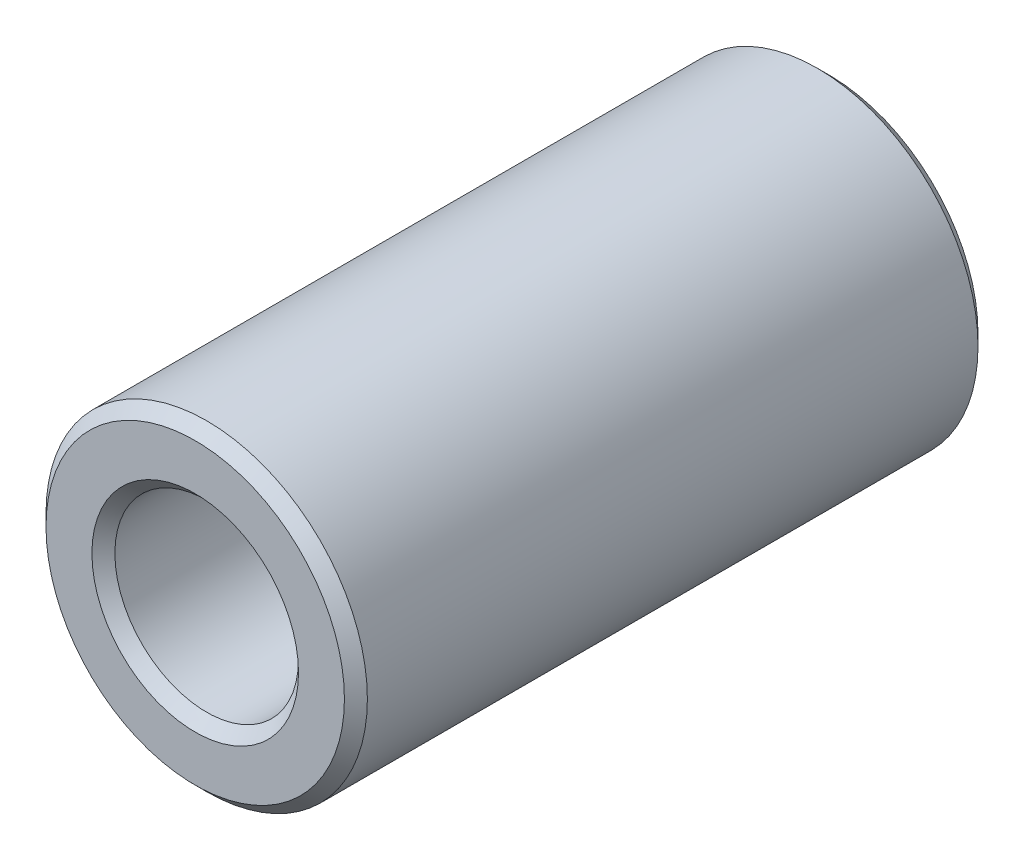
ISO-10303-21;
HEADER;
FILE_DESCRIPTION(('STEP AP214'),'2;1');
FILE_NAME('part.step','',(''),(''),'','','');
FILE_SCHEMA(('AUTOMOTIVE_DESIGN { 1 0 10303 214 1 1 1 1 }'));
ENDSEC;
DATA;
#1=APPLICATION_CONTEXT('core data for automotive mechanical design processes');
#2=APPLICATION_PROTOCOL_DEFINITION('international standard','automotive_design',2000,#1);
#3=PRODUCT_CONTEXT('',#1,'mechanical');
#4=PRODUCT('Part','Part','',(#3));
#5=PRODUCT_RELATED_PRODUCT_CATEGORY('part','',(#4));
#6=PRODUCT_DEFINITION_FORMATION('','',#4);
#7=PRODUCT_DEFINITION_CONTEXT('part definition',#1,'design');
#8=PRODUCT_DEFINITION('design','',#6,#7);
#9=PRODUCT_DEFINITION_SHAPE('','',#8);
#10=(LENGTH_UNIT() NAMED_UNIT(*) SI_UNIT(.MILLI.,.METRE.));
#11=(NAMED_UNIT(*) PLANE_ANGLE_UNIT() SI_UNIT($,.RADIAN.));
#12=(NAMED_UNIT(*) SI_UNIT($,.STERADIAN.) SOLID_ANGLE_UNIT());
#13=UNCERTAINTY_MEASURE_WITH_UNIT(LENGTH_MEASURE(1.E-05),#10,'distance_accuracy_value','');
#14=(GEOMETRIC_REPRESENTATION_CONTEXT(3) GLOBAL_UNCERTAINTY_ASSIGNED_CONTEXT((#13)) GLOBAL_UNIT_ASSIGNED_CONTEXT((#10,
#11,#12)) REPRESENTATION_CONTEXT('',''));
#15=CARTESIAN_POINT('',(0.,0.,0.));
#16=DIRECTION('',(0.,0.,1.));
#17=DIRECTION('',(1.,0.,0.));
#18=AXIS2_PLACEMENT_3D('',#15,#16,#17);
#19=CARTESIAN_POINT('',(0.,0.,27.6));
#20=DIRECTION('',(0.,0.,1.));
#21=DIRECTION('',(1.,0.,0.));
#22=AXIS2_PLACEMENT_3D('',#19,#20,#21);
#23=PLANE('',#22);
#24=CARTESIAN_POINT('',(0.,0.,27.6));
#25=DIRECTION('',(0.,0.,1.));
#26=DIRECTION('',(1.,0.,0.));
#27=AXIS2_PLACEMENT_3D('',#24,#25,#26);
#28=CIRCLE('',#27,4.5);
#29=CARTESIAN_POINT('',(4.5,0.,27.6));
#30=VERTEX_POINT('',#29);
#31=EDGE_CURVE('E10',#30,#30,#28,.F.);
#32=ORIENTED_EDGE('',*,*,#31,.T.);
#33=EDGE_LOOP('',(#32));
#34=FACE_BOUND('',#33,.T.);
#35=CARTESIAN_POINT('',(0.,0.,27.6));
#36=DIRECTION('',(0.,0.,1.));
#37=DIRECTION('',(1.,0.,0.));
#38=AXIS2_PLACEMENT_3D('',#35,#36,#37);
#39=CIRCLE('',#38,6.49999999999999);
#40=CARTESIAN_POINT('',(6.49999999999999,0.,27.6));
#41=VERTEX_POINT('',#40);
#42=EDGE_CURVE('E35',#41,#41,#39,.T.);
#43=ORIENTED_EDGE('',*,*,#42,.T.);
#44=EDGE_LOOP('',(#43));
#45=FACE_BOUND('',#44,.T.);
#46=ADVANCED_FACE('F28',(#34,#45),#23,.T.);
#47=CARTESIAN_POINT('',(0.,0.,0.));
#48=DIRECTION('',(0.,0.,1.));
#49=DIRECTION('',(1.,0.,0.));
#50=AXIS2_PLACEMENT_3D('',#47,#48,#49);
#51=PLANE('',#50);
#52=CARTESIAN_POINT('',(0.,0.,0.));
#53=DIRECTION('',(0.,0.,1.));
#54=DIRECTION('',(1.,0.,0.));
#55=AXIS2_PLACEMENT_3D('',#52,#53,#54);
#56=CIRCLE('',#55,4.50000000000001);
#57=CARTESIAN_POINT('',(4.50000000000001,0.,0.));
#58=VERTEX_POINT('',#57);
#59=EDGE_CURVE('E54',#58,#58,#56,.T.);
#60=ORIENTED_EDGE('',*,*,#59,.T.);
#61=EDGE_LOOP('',(#60));
#62=FACE_BOUND('',#61,.T.);
#63=CARTESIAN_POINT('',(0.,0.,0.));
#64=DIRECTION('',(0.,0.,1.));
#65=DIRECTION('',(1.,0.,0.));
#66=AXIS2_PLACEMENT_3D('',#63,#64,#65);
#67=CIRCLE('',#66,6.5);
#68=CARTESIAN_POINT('',(6.5,0.,0.));
#69=VERTEX_POINT('',#68);
#70=EDGE_CURVE('E57',#69,#69,#67,.F.);
#71=ORIENTED_EDGE('',*,*,#70,.T.);
#72=EDGE_LOOP('',(#71));
#73=FACE_BOUND('',#72,.T.);
#74=ADVANCED_FACE('F61',(#62,#73),#51,.F.);
#75=CARTESIAN_POINT('',(0.,0.,27.6));
#76=DIRECTION('',(0.,0.,-1.));
#77=DIRECTION('',(-1.,0.,0.));
#78=AXIS2_PLACEMENT_3D('',#75,#76,#77);
#79=CYLINDRICAL_SURFACE('',#78,7.);
#80=CARTESIAN_POINT('',(0.,0.,0.500000000000007));
#81=DIRECTION('',(0.,0.,1.));
#82=DIRECTION('',(1.,0.,0.));
#83=AXIS2_PLACEMENT_3D('',#80,#81,#82);
#84=CIRCLE('',#83,7.);
#85=CARTESIAN_POINT('',(-7.,0.,0.500000000000007));
#86=VERTEX_POINT('',#85);
#87=EDGE_CURVE('E39',#86,#86,#84,.T.);
#88=CARTESIAN_POINT('',(0.,0.,27.1));
#89=DIRECTION('',(0.,0.,1.));
#90=DIRECTION('',(1.,0.,0.));
#91=AXIS2_PLACEMENT_3D('',#88,#89,#90);
#92=CIRCLE('',#91,7.);
#93=CARTESIAN_POINT('',(-7.,0.,27.1));
#94=VERTEX_POINT('',#93);
#95=EDGE_CURVE('E43',#94,#94,#92,.F.);
#96=CARTESIAN_POINT('',(-7.,0.,0.500000000000007));
#97=CARTESIAN_POINT('',(-7.,0.,0.77708333333334));
#98=CARTESIAN_POINT('',(-7.,0.,1.05416666666667));
#99=CARTESIAN_POINT('',(-7.,0.,1.60833333333334));
#100=CARTESIAN_POINT('',(-7.,0.,1.88541666666667));
#101=CARTESIAN_POINT('',(-7.,0.,2.43958333333334));
#102=CARTESIAN_POINT('',(-7.,0.,2.71666666666667));
#103=CARTESIAN_POINT('',(-7.,0.,3.27083333333334));
#104=CARTESIAN_POINT('',(-7.,0.,3.54791666666667));
#105=CARTESIAN_POINT('',(-7.,0.,4.10208333333334));
#106=CARTESIAN_POINT('',(-7.,0.,4.37916666666667));
#107=CARTESIAN_POINT('',(-7.,0.,4.93333333333334));
#108=CARTESIAN_POINT('',(-7.,0.,5.21041666666667));
#109=CARTESIAN_POINT('',(-7.,0.,5.76458333333334));
#110=CARTESIAN_POINT('',(-7.,0.,6.04166666666667));
#111=CARTESIAN_POINT('',(-7.,0.,6.59583333333334));
#112=CARTESIAN_POINT('',(-7.,0.,6.87291666666667));
#113=CARTESIAN_POINT('',(-7.,0.,7.42708333333334));
#114=CARTESIAN_POINT('',(-7.,0.,7.70416666666667));
#115=CARTESIAN_POINT('',(-7.,0.,8.25833333333334));
#116=CARTESIAN_POINT('',(-7.,0.,8.53541666666667));
#117=CARTESIAN_POINT('',(-7.,0.,9.08958333333334));
#118=CARTESIAN_POINT('',(-7.,0.,9.36666666666667));
#119=CARTESIAN_POINT('',(-7.,0.,9.92083333333334));
#120=CARTESIAN_POINT('',(-7.,0.,10.1979166666667));
#121=CARTESIAN_POINT('',(-7.,0.,10.7520833333333));
#122=CARTESIAN_POINT('',(-7.,0.,11.0291666666667));
#123=CARTESIAN_POINT('',(-7.,0.,11.5833333333333));
#124=CARTESIAN_POINT('',(-7.,0.,11.8604166666667));
#125=CARTESIAN_POINT('',(-7.,0.,12.4145833333333));
#126=CARTESIAN_POINT('',(-7.,0.,12.6916666666667));
#127=CARTESIAN_POINT('',(-7.,0.,13.2458333333333));
#128=CARTESIAN_POINT('',(-7.,0.,13.5229166666667));
#129=CARTESIAN_POINT('',(-7.,0.,14.0770833333333));
#130=CARTESIAN_POINT('',(-7.,0.,14.3541666666667));
#131=CARTESIAN_POINT('',(-7.,0.,14.9083333333333));
#132=CARTESIAN_POINT('',(-7.,0.,15.1854166666667));
#133=CARTESIAN_POINT('',(-7.,0.,15.7395833333333));
#134=CARTESIAN_POINT('',(-7.,0.,16.0166666666667));
#135=CARTESIAN_POINT('',(-7.,0.,16.5708333333333));
#136=CARTESIAN_POINT('',(-7.,0.,16.8479166666667));
#137=CARTESIAN_POINT('',(-7.,0.,17.4020833333333));
#138=CARTESIAN_POINT('',(-7.,0.,17.6791666666667));
#139=CARTESIAN_POINT('',(-7.,0.,18.2333333333333));
#140=CARTESIAN_POINT('',(-7.,0.,18.5104166666667));
#141=CARTESIAN_POINT('',(-7.,0.,19.0645833333333));
#142=CARTESIAN_POINT('',(-7.,0.,19.3416666666667));
#143=CARTESIAN_POINT('',(-7.,0.,19.8958333333333));
#144=CARTESIAN_POINT('',(-7.,0.,20.1729166666667));
#145=CARTESIAN_POINT('',(-7.,0.,20.7270833333333));
#146=CARTESIAN_POINT('',(-7.,0.,21.0041666666667));
#147=CARTESIAN_POINT('',(-7.,0.,21.5583333333333));
#148=CARTESIAN_POINT('',(-7.,0.,21.8354166666667));
#149=CARTESIAN_POINT('',(-7.,0.,22.3895833333333));
#150=CARTESIAN_POINT('',(-7.,0.,22.6666666666667));
#151=CARTESIAN_POINT('',(-7.,0.,23.2208333333333));
#152=CARTESIAN_POINT('',(-7.,0.,23.4979166666667));
#153=CARTESIAN_POINT('',(-7.,0.,24.0520833333333));
#154=CARTESIAN_POINT('',(-7.,0.,24.3291666666667));
#155=CARTESIAN_POINT('',(-7.,0.,24.8833333333333));
#156=CARTESIAN_POINT('',(-7.,0.,25.1604166666667));
#157=CARTESIAN_POINT('',(-7.,0.,25.7145833333333));
#158=CARTESIAN_POINT('',(-7.,0.,25.9916666666667));
#159=CARTESIAN_POINT('',(-7.,0.,26.5458333333333));
#160=CARTESIAN_POINT('',(-7.,0.,26.8229166666667));
#161=CARTESIAN_POINT('',(-7.,0.,27.1));
#162=B_SPLINE_CURVE_WITH_KNOTS('',3,(#96,#97,#98,#99,#100,#101,#102,#103,#104,#105,#106,#107,
#108,#109,#110,#111,#112,#113,#114,#115,#116,#117,#118,#119,#120,#121,#122,#123,#124,#125,#126,
#127,#128,#129,#130,#131,#132,#133,#134,#135,#136,#137,#138,#139,#140,#141,#142,#143,#144,#145,
#146,#147,#148,#149,#150,#151,#152,#153,#154,#155,#156,#157,#158,#159,#160,#161),.UNSPECIFIED.,
.F.,.F.,(4,2,2,2,2,2,2,2,2,2,2,2,2,2,2,2,2,2,2,2,2,2,2,2,2,2,2,2,2,2,2,2,4),(0.,
0.831249999999999,1.6625,2.49375,3.325,4.15625,4.9875,5.81875,6.65,7.48125,8.3125,9.14375,9.975,
10.80625,11.6375,12.46875,13.3,14.13125,14.9625,15.79375,16.625,17.45625,18.2875,19.11875,19.95,
20.78125,21.6125,22.44375,23.275,24.10625,24.9375,25.76875,26.6),.UNSPECIFIED.);
#163=EDGE_CURVE('BSEAM30',#86,#94,#162,.T.);
#164=ORIENTED_EDGE('',*,*,#87,.T.);
#165=ORIENTED_EDGE('',*,*,#95,.T.);
#166=ORIENTED_EDGE('',*,*,#163,.T.);
#167=ORIENTED_EDGE('',*,*,#163,.F.);
#168=EDGE_LOOP('',(#164,#166,#165,#167));
#169=FACE_BOUND('',#168,.T.);
#170=ADVANCED_FACE('F30',(#169),#79,.T.);
#171=CARTESIAN_POINT('',(0.,0.,27.6));
#172=DIRECTION('',(0.,0.,-1.));
#173=DIRECTION('',(-1.,0.,0.));
#174=AXIS2_PLACEMENT_3D('',#171,#172,#173);
#175=CYLINDRICAL_SURFACE('',#174,4.);
#176=CARTESIAN_POINT('',(0.,0.,0.500000000000004));
#177=DIRECTION('',(0.,0.,1.));
#178=DIRECTION('',(1.,0.,0.));
#179=AXIS2_PLACEMENT_3D('',#176,#177,#178);
#180=CIRCLE('',#179,4.);
#181=CARTESIAN_POINT('',(-4.,0.,0.5));
#182=VERTEX_POINT('',#181);
#183=EDGE_CURVE('E48',#182,#182,#180,.F.);
#184=CARTESIAN_POINT('',(0.,0.,27.1));
#185=DIRECTION('',(0.,0.,1.));
#186=DIRECTION('',(1.,0.,0.));
#187=AXIS2_PLACEMENT_3D('',#184,#185,#186);
#188=CIRCLE('',#187,4.);
#189=CARTESIAN_POINT('',(-4.,0.,27.1));
#190=VERTEX_POINT('',#189);
#191=EDGE_CURVE('E51',#190,#190,#188,.T.);
#192=CARTESIAN_POINT('',(-4.,0.,0.5));
#193=CARTESIAN_POINT('',(-4.,0.,0.777083333333333));
#194=CARTESIAN_POINT('',(-4.,0.,1.05416666666667));
#195=CARTESIAN_POINT('',(-4.,0.,1.60833333333333));
#196=CARTESIAN_POINT('',(-4.,0.,1.88541666666667));
#197=CARTESIAN_POINT('',(-4.,0.,2.43958333333333));
#198=CARTESIAN_POINT('',(-4.,0.,2.71666666666667));
#199=CARTESIAN_POINT('',(-4.,0.,3.27083333333333));
#200=CARTESIAN_POINT('',(-4.,0.,3.54791666666667));
#201=CARTESIAN_POINT('',(-4.,0.,4.10208333333334));
#202=CARTESIAN_POINT('',(-4.,0.,4.37916666666667));
#203=CARTESIAN_POINT('',(-4.,0.,4.93333333333333));
#204=CARTESIAN_POINT('',(-4.,0.,5.21041666666667));
#205=CARTESIAN_POINT('',(-4.,0.,5.76458333333333));
#206=CARTESIAN_POINT('',(-4.,0.,6.04166666666667));
#207=CARTESIAN_POINT('',(-4.,0.,6.59583333333333));
#208=CARTESIAN_POINT('',(-4.,0.,6.87291666666667));
#209=CARTESIAN_POINT('',(-4.,0.,7.42708333333333));
#210=CARTESIAN_POINT('',(-4.,0.,7.70416666666667));
#211=CARTESIAN_POINT('',(-4.,0.,8.25833333333333));
#212=CARTESIAN_POINT('',(-4.,0.,8.53541666666667));
#213=CARTESIAN_POINT('',(-4.,0.,9.08958333333333));
#214=CARTESIAN_POINT('',(-4.,0.,9.36666666666667));
#215=CARTESIAN_POINT('',(-4.,0.,9.92083333333333));
#216=CARTESIAN_POINT('',(-4.,0.,10.1979166666667));
#217=CARTESIAN_POINT('',(-4.,0.,10.7520833333333));
#218=CARTESIAN_POINT('',(-4.,0.,11.0291666666667));
#219=CARTESIAN_POINT('',(-4.,0.,11.5833333333333));
#220=CARTESIAN_POINT('',(-4.,0.,11.8604166666667));
#221=CARTESIAN_POINT('',(-4.,0.,12.4145833333333));
#222=CARTESIAN_POINT('',(-4.,0.,12.6916666666667));
#223=CARTESIAN_POINT('',(-4.,0.,13.2458333333333));
#224=CARTESIAN_POINT('',(-4.,0.,13.5229166666667));
#225=CARTESIAN_POINT('',(-4.,0.,14.0770833333333));
#226=CARTESIAN_POINT('',(-4.,0.,14.3541666666667));
#227=CARTESIAN_POINT('',(-4.,0.,14.9083333333333));
#228=CARTESIAN_POINT('',(-4.,0.,15.1854166666667));
#229=CARTESIAN_POINT('',(-4.,0.,15.7395833333333));
#230=CARTESIAN_POINT('',(-4.,0.,16.0166666666667));
#231=CARTESIAN_POINT('',(-4.,0.,16.5708333333333));
#232=CARTESIAN_POINT('',(-4.,0.,16.8479166666667));
#233=CARTESIAN_POINT('',(-4.,0.,17.4020833333333));
#234=CARTESIAN_POINT('',(-4.,0.,17.6791666666667));
#235=CARTESIAN_POINT('',(-4.,0.,18.2333333333333));
#236=CARTESIAN_POINT('',(-4.,0.,18.5104166666667));
#237=CARTESIAN_POINT('',(-4.,0.,19.0645833333333));
#238=CARTESIAN_POINT('',(-4.,0.,19.3416666666667));
#239=CARTESIAN_POINT('',(-4.,0.,19.8958333333333));
#240=CARTESIAN_POINT('',(-4.,0.,20.1729166666667));
#241=CARTESIAN_POINT('',(-4.,0.,20.7270833333333));
#242=CARTESIAN_POINT('',(-4.,0.,21.0041666666667));
#243=CARTESIAN_POINT('',(-4.,0.,21.5583333333333));
#244=CARTESIAN_POINT('',(-4.,0.,21.8354166666667));
#245=CARTESIAN_POINT('',(-4.,0.,22.3895833333333));
#246=CARTESIAN_POINT('',(-4.,0.,22.6666666666667));
#247=CARTESIAN_POINT('',(-4.,0.,23.2208333333333));
#248=CARTESIAN_POINT('',(-4.,0.,23.4979166666667));
#249=CARTESIAN_POINT('',(-4.,0.,24.0520833333333));
#250=CARTESIAN_POINT('',(-4.,0.,24.3291666666667));
#251=CARTESIAN_POINT('',(-4.,0.,24.8833333333333));
#252=CARTESIAN_POINT('',(-4.,0.,25.1604166666667));
#253=CARTESIAN_POINT('',(-4.,0.,25.7145833333333));
#254=CARTESIAN_POINT('',(-4.,0.,25.9916666666667));
#255=CARTESIAN_POINT('',(-4.,0.,26.5458333333333));
#256=CARTESIAN_POINT('',(-4.,0.,26.8229166666667));
#257=CARTESIAN_POINT('',(-4.,0.,27.1));
#258=B_SPLINE_CURVE_WITH_KNOTS('',3,(#192,#193,#194,#195,#196,#197,#198,#199,#200,#201,#202,
#203,#204,#205,#206,#207,#208,#209,#210,#211,#212,#213,#214,#215,#216,#217,#218,#219,#220,#221,
#222,#223,#224,#225,#226,#227,#228,#229,#230,#231,#232,#233,#234,#235,#236,#237,#238,#239,#240,
#241,#242,#243,#244,#245,#246,#247,#248,#249,#250,#251,#252,#253,#254,#255,#256,#257),
.UNSPECIFIED.,.F.,.F.,(4,2,2,2,2,2,2,2,2,2,2,2,2,2,2,2,2,2,2,2,2,2,2,2,2,2,2,2,2,2,2,2,4),(0.,
0.831249999999999,1.6625,2.49375,3.325,4.15625,4.9875,5.81875,6.65,7.48125,8.3125,9.14375,9.975,
10.80625,11.6375,12.46875,13.3,14.13125,14.9625,15.79375,16.625,17.45625,18.2875,19.11875,19.95,
20.78125,21.6125,22.44375,23.275,24.10625,24.9375,25.76875,26.6),.UNSPECIFIED.);
#259=EDGE_CURVE('BSEAM73',#182,#190,#258,.T.);
#260=ORIENTED_EDGE('',*,*,#183,.T.);
#261=ORIENTED_EDGE('',*,*,#191,.T.);
#262=ORIENTED_EDGE('',*,*,#259,.T.);
#263=ORIENTED_EDGE('',*,*,#259,.F.);
#264=EDGE_LOOP('',(#260,#262,#261,#263));
#265=FACE_BOUND('',#264,.T.);
#266=ADVANCED_FACE('F73',(#265),#175,.F.);
#267=CARTESIAN_POINT('',(0.,0.,0.));
#268=DIRECTION('',(0.,0.,-1.));
#269=DIRECTION('',(-1.,0.,0.));
#270=AXIS2_PLACEMENT_3D('',#267,#268,#269);
#271=CONICAL_SURFACE('',#270,4.50000000000001,0.785398163397453);
#272=ORIENTED_EDGE('',*,*,#183,.F.);
#273=EDGE_LOOP('',(#272));
#274=FACE_BOUND('',#273,.T.);
#275=ORIENTED_EDGE('',*,*,#59,.F.);
#276=EDGE_LOOP('',(#275));
#277=FACE_BOUND('',#276,.T.);
#278=ADVANCED_FACE('F67',(#274,#277),#271,.F.);
#279=CARTESIAN_POINT('',(0.,0.,0.500000000000007));
#280=DIRECTION('',(0.,0.,1.));
#281=DIRECTION('',(1.,0.,0.));
#282=AXIS2_PLACEMENT_3D('',#279,#280,#281);
#283=CONICAL_SURFACE('',#282,7.,0.785398163397445);
#284=ORIENTED_EDGE('',*,*,#70,.F.);
#285=EDGE_LOOP('',(#284));
#286=FACE_BOUND('',#285,.T.);
#287=ORIENTED_EDGE('',*,*,#87,.F.);
#288=EDGE_LOOP('',(#287));
#289=FACE_BOUND('',#288,.T.);
#290=ADVANCED_FACE('F63',(#286,#289),#283,.T.);
#291=CARTESIAN_POINT('',(0.,0.,27.1));
#292=DIRECTION('',(0.,0.,1.));
#293=DIRECTION('',(1.,0.,0.));
#294=AXIS2_PLACEMENT_3D('',#291,#292,#293);
#295=CONICAL_SURFACE('',#294,4.,0.785398163397445);
#296=ORIENTED_EDGE('',*,*,#31,.F.);
#297=EDGE_LOOP('',(#296));
#298=FACE_BOUND('',#297,.T.);
#299=ORIENTED_EDGE('',*,*,#191,.F.);
#300=EDGE_LOOP('',(#299));
#301=FACE_BOUND('',#300,.T.);
#302=ADVANCED_FACE('F66',(#298,#301),#295,.F.);
#303=CARTESIAN_POINT('',(0.,0.,27.6));
#304=DIRECTION('',(0.,0.,-1.));
#305=DIRECTION('',(-1.,0.,0.));
#306=AXIS2_PLACEMENT_3D('',#303,#304,#305);
#307=CONICAL_SURFACE('',#306,6.49999999999999,0.785398163397453);
#308=ORIENTED_EDGE('',*,*,#95,.F.);
#309=EDGE_LOOP('',(#308));
#310=FACE_BOUND('',#309,.T.);
#311=ORIENTED_EDGE('',*,*,#42,.F.);
#312=EDGE_LOOP('',(#311));
#313=FACE_BOUND('',#312,.T.);
#314=ADVANCED_FACE('F76',(#310,#313),#307,.T.);
#315=CLOSED_SHELL('',(#46,#74,#170,#266,#278,#290,#302,#314));
#316=MANIFOLD_SOLID_BREP('B2',#315);
#317=ADVANCED_BREP_SHAPE_REPRESENTATION('',(#18,#316),#14);
#318=SHAPE_DEFINITION_REPRESENTATION(#9,#317);
ENDSEC;
END-ISO-10303-21;
